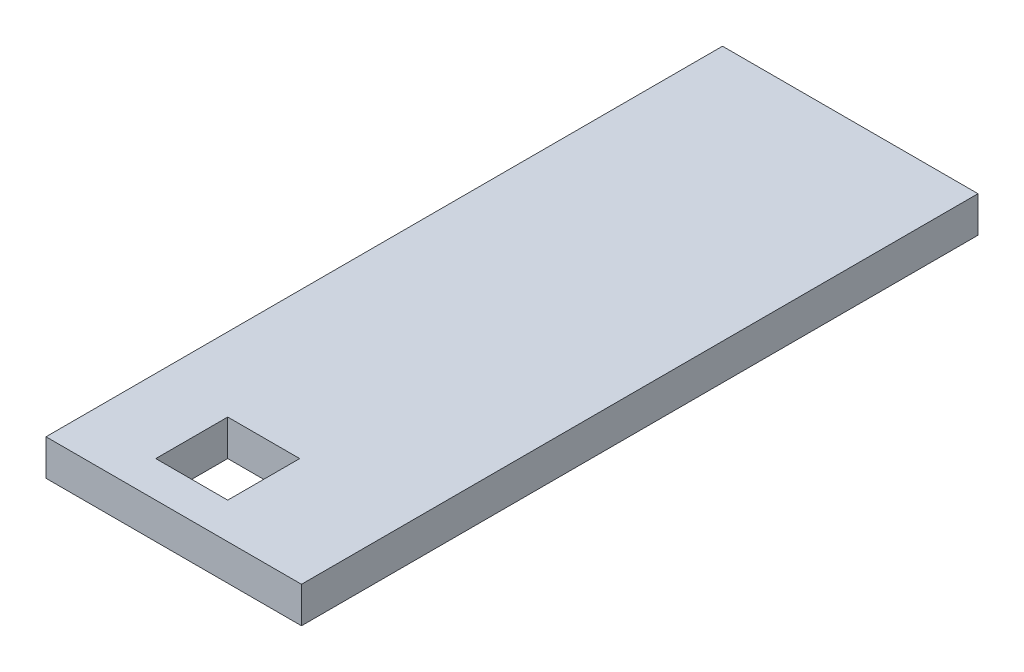
ISO-10303-21;
HEADER;
FILE_DESCRIPTION(('STEP AP214'),'2;1');
FILE_NAME('part.step','',(''),(''),'','','');
FILE_SCHEMA(('AUTOMOTIVE_DESIGN { 1 0 10303 214 1 1 1 1 }'));
ENDSEC;
DATA;
#1=APPLICATION_CONTEXT('core data for automotive mechanical design processes');
#2=APPLICATION_PROTOCOL_DEFINITION('international standard','automotive_design',2000,#1);
#3=PRODUCT_CONTEXT('',#1,'mechanical');
#4=PRODUCT('Part','Part','',(#3));
#5=PRODUCT_RELATED_PRODUCT_CATEGORY('part','',(#4));
#6=PRODUCT_DEFINITION_FORMATION('','',#4);
#7=PRODUCT_DEFINITION_CONTEXT('part definition',#1,'design');
#8=PRODUCT_DEFINITION('design','',#6,#7);
#9=PRODUCT_DEFINITION_SHAPE('','',#8);
#10=(LENGTH_UNIT() NAMED_UNIT(*) SI_UNIT(.MILLI.,.METRE.));
#11=(NAMED_UNIT(*) PLANE_ANGLE_UNIT() SI_UNIT($,.RADIAN.));
#12=(NAMED_UNIT(*) SI_UNIT($,.STERADIAN.) SOLID_ANGLE_UNIT());
#13=UNCERTAINTY_MEASURE_WITH_UNIT(LENGTH_MEASURE(1.E-05),#10,'distance_accuracy_value','');
#14=(GEOMETRIC_REPRESENTATION_CONTEXT(3) GLOBAL_UNCERTAINTY_ASSIGNED_CONTEXT((#13)) GLOBAL_UNIT_ASSIGNED_CONTEXT((#10,
#11,#12)) REPRESENTATION_CONTEXT('',''));
#15=CARTESIAN_POINT('',(0.,0.,0.));
#16=DIRECTION('',(0.,0.,1.));
#17=DIRECTION('',(1.,0.,0.));
#18=AXIS2_PLACEMENT_3D('',#15,#16,#17);
#19=CARTESIAN_POINT('',(0.,0.,940.));
#20=DIRECTION('',(1.,0.,0.));
#21=DIRECTION('',(0.,0.,-1.));
#22=AXIS2_PLACEMENT_3D('',#19,#20,#21);
#23=PLANE('',#22);
#24=DIRECTION('',(0.,-1.,0.));
#25=VECTOR('',#24,1.);
#26=CARTESIAN_POINT('',(0.,0.,0.));
#27=LINE('',#26,#25);
#28=CARTESIAN_POINT('',(0.,50.,0.));
#29=VERTEX_POINT('',#28);
#30=CARTESIAN_POINT('',(0.,0.,0.));
#31=VERTEX_POINT('',#30);
#32=EDGE_CURVE('E130',#29,#31,#27,.T.);
#33=ORIENTED_EDGE('',*,*,#32,.T.);
#34=DIRECTION('',(0.,0.,-1.));
#35=VECTOR('',#34,1.);
#36=CARTESIAN_POINT('',(0.,0.,940.));
#37=LINE('',#36,#35);
#38=CARTESIAN_POINT('',(0.,0.,940.));
#39=VERTEX_POINT('',#38);
#40=EDGE_CURVE('E11',#39,#31,#37,.T.);
#41=ORIENTED_EDGE('',*,*,#40,.F.);
#42=DIRECTION('',(0.,-1.,0.));
#43=VECTOR('',#42,1.);
#44=CARTESIAN_POINT('',(0.,0.,940.));
#45=LINE('',#44,#43);
#46=CARTESIAN_POINT('',(0.,50.,940.));
#47=VERTEX_POINT('',#46);
#48=EDGE_CURVE('E134',#47,#39,#45,.T.);
#49=ORIENTED_EDGE('',*,*,#48,.F.);
#50=DIRECTION('',(0.,0.,-1.));
#51=VECTOR('',#50,1.);
#52=CARTESIAN_POINT('',(0.,50.,940.));
#53=LINE('',#52,#51);
#54=EDGE_CURVE('E144',#47,#29,#53,.T.);
#55=ORIENTED_EDGE('',*,*,#54,.T.);
#56=EDGE_LOOP('',(#33,#41,#49,#55));
#57=FACE_BOUND('',#56,.T.);
#58=ADVANCED_FACE('F33',(#57),#23,.F.);
#59=CARTESIAN_POINT('',(0.,0.,940.));
#60=DIRECTION('',(0.,1.,0.));
#61=DIRECTION('',(0.,0.,1.));
#62=AXIS2_PLACEMENT_3D('',#59,#60,#61);
#63=PLANE('',#62);
#64=DIRECTION('',(1.,0.,0.));
#65=VECTOR('',#64,1.);
#66=CARTESIAN_POINT('',(202.5,0.,890.));
#67=LINE('',#66,#65);
#68=CARTESIAN_POINT('',(102.5,0.,890.));
#69=VERTEX_POINT('',#68);
#70=CARTESIAN_POINT('',(202.5,0.,890.));
#71=VERTEX_POINT('',#70);
#72=EDGE_CURVE('E105',#69,#71,#67,.T.);
#73=ORIENTED_EDGE('',*,*,#72,.T.);
#74=DIRECTION('',(0.,0.,-1.));
#75=VECTOR('',#74,1.);
#76=CARTESIAN_POINT('',(202.5,0.,890.));
#77=LINE('',#76,#75);
#78=CARTESIAN_POINT('',(202.5,0.,790.));
#79=VERTEX_POINT('',#78);
#80=EDGE_CURVE('E99',#71,#79,#77,.T.);
#81=ORIENTED_EDGE('',*,*,#80,.T.);
#82=DIRECTION('',(-1.,0.,0.));
#83=VECTOR('',#82,1.);
#84=CARTESIAN_POINT('',(202.5,0.,790.));
#85=LINE('',#84,#83);
#86=CARTESIAN_POINT('',(102.5,0.,790.));
#87=VERTEX_POINT('',#86);
#88=EDGE_CURVE('E108',#79,#87,#85,.T.);
#89=ORIENTED_EDGE('',*,*,#88,.T.);
#90=DIRECTION('',(0.,0.,1.));
#91=VECTOR('',#90,1.);
#92=CARTESIAN_POINT('',(102.5,0.,890.));
#93=LINE('',#92,#91);
#94=EDGE_CURVE('E47',#87,#69,#93,.T.);
#95=ORIENTED_EDGE('',*,*,#94,.T.);
#96=EDGE_LOOP('',(#73,#81,#89,#95));
#97=FACE_BOUND('',#96,.T.);
#98=DIRECTION('',(1.,0.,0.));
#99=VECTOR('',#98,1.);
#100=CARTESIAN_POINT('',(0.,0.,0.));
#101=LINE('',#100,#99);
#102=CARTESIAN_POINT('',(355.,0.,0.));
#103=VERTEX_POINT('',#102);
#104=EDGE_CURVE('E147',#31,#103,#101,.T.);
#105=ORIENTED_EDGE('',*,*,#104,.T.);
#106=DIRECTION('',(0.,0.,-1.));
#107=VECTOR('',#106,1.);
#108=CARTESIAN_POINT('',(355.,0.,940.));
#109=LINE('',#108,#107);
#110=CARTESIAN_POINT('',(355.,0.,940.));
#111=VERTEX_POINT('',#110);
#112=EDGE_CURVE('E40',#111,#103,#109,.T.);
#113=ORIENTED_EDGE('',*,*,#112,.F.);
#114=DIRECTION('',(1.,0.,0.));
#115=VECTOR('',#114,1.);
#116=CARTESIAN_POINT('',(0.,0.,940.));
#117=LINE('',#116,#115);
#118=EDGE_CURVE('E137',#39,#111,#117,.T.);
#119=ORIENTED_EDGE('',*,*,#118,.F.);
#120=ORIENTED_EDGE('',*,*,#40,.T.);
#121=EDGE_LOOP('',(#105,#113,#119,#120));
#122=FACE_BOUND('',#121,.T.);
#123=ADVANCED_FACE('F112',(#97,#122),#63,.F.);
#124=CARTESIAN_POINT('',(355.,0.,940.));
#125=DIRECTION('',(-1.,0.,0.));
#126=DIRECTION('',(0.,0.,1.));
#127=AXIS2_PLACEMENT_3D('',#124,#125,#126);
#128=PLANE('',#127);
#129=DIRECTION('',(0.,1.,0.));
#130=VECTOR('',#129,1.);
#131=CARTESIAN_POINT('',(355.,0.,0.));
#132=LINE('',#131,#130);
#133=CARTESIAN_POINT('',(355.,50.,0.));
#134=VERTEX_POINT('',#133);
#135=EDGE_CURVE('E149',#103,#134,#132,.T.);
#136=ORIENTED_EDGE('',*,*,#135,.T.);
#137=DIRECTION('',(0.,0.,-1.));
#138=VECTOR('',#137,1.);
#139=CARTESIAN_POINT('',(355.,50.,940.));
#140=LINE('',#139,#138);
#141=CARTESIAN_POINT('',(355.,50.,940.));
#142=VERTEX_POINT('',#141);
#143=EDGE_CURVE('E154',#142,#134,#140,.T.);
#144=ORIENTED_EDGE('',*,*,#143,.F.);
#145=DIRECTION('',(0.,1.,0.));
#146=VECTOR('',#145,1.);
#147=CARTESIAN_POINT('',(355.,0.,940.));
#148=LINE('',#147,#146);
#149=EDGE_CURVE('E140',#111,#142,#148,.T.);
#150=ORIENTED_EDGE('',*,*,#149,.F.);
#151=ORIENTED_EDGE('',*,*,#112,.T.);
#152=EDGE_LOOP('',(#136,#144,#150,#151));
#153=FACE_BOUND('',#152,.T.);
#154=ADVANCED_FACE('F161',(#153),#128,.F.);
#155=CARTESIAN_POINT('',(0.,50.,940.));
#156=DIRECTION('',(0.,-1.,0.));
#157=DIRECTION('',(0.,0.,-1.));
#158=AXIS2_PLACEMENT_3D('',#155,#156,#157);
#159=PLANE('',#158);
#160=DIRECTION('',(-1.,0.,0.));
#161=VECTOR('',#160,1.);
#162=CARTESIAN_POINT('',(202.5,50.,790.));
#163=LINE('',#162,#161);
#164=CARTESIAN_POINT('',(202.5,50.,790.));
#165=VERTEX_POINT('',#164);
#166=CARTESIAN_POINT('',(102.5,50.,790.));
#167=VERTEX_POINT('',#166);
#168=EDGE_CURVE('E124',#165,#167,#163,.T.);
#169=ORIENTED_EDGE('',*,*,#168,.F.);
#170=DIRECTION('',(0.,0.,-1.));
#171=VECTOR('',#170,1.);
#172=CARTESIAN_POINT('',(202.5,50.,890.));
#173=LINE('',#172,#171);
#174=CARTESIAN_POINT('',(202.5,50.,890.));
#175=VERTEX_POINT('',#174);
#176=EDGE_CURVE('E55',#175,#165,#173,.T.);
#177=ORIENTED_EDGE('',*,*,#176,.F.);
#178=DIRECTION('',(1.,0.,0.));
#179=VECTOR('',#178,1.);
#180=CARTESIAN_POINT('',(202.5,50.,890.));
#181=LINE('',#180,#179);
#182=CARTESIAN_POINT('',(102.5,50.,890.));
#183=VERTEX_POINT('',#182);
#184=EDGE_CURVE('E115',#183,#175,#181,.T.);
#185=ORIENTED_EDGE('',*,*,#184,.F.);
#186=DIRECTION('',(0.,0.,1.));
#187=VECTOR('',#186,1.);
#188=CARTESIAN_POINT('',(102.5,50.,890.));
#189=LINE('',#188,#187);
#190=EDGE_CURVE('E118',#167,#183,#189,.T.);
#191=ORIENTED_EDGE('',*,*,#190,.F.);
#192=EDGE_LOOP('',(#169,#177,#185,#191));
#193=FACE_BOUND('',#192,.T.);
#194=DIRECTION('',(-1.,0.,0.));
#195=VECTOR('',#194,1.);
#196=CARTESIAN_POINT('',(0.,50.,0.));
#197=LINE('',#196,#195);
#198=EDGE_CURVE('E138',#134,#29,#197,.T.);
#199=ORIENTED_EDGE('',*,*,#198,.T.);
#200=ORIENTED_EDGE('',*,*,#54,.F.);
#201=DIRECTION('',(-1.,0.,0.));
#202=VECTOR('',#201,1.);
#203=CARTESIAN_POINT('',(0.,50.,940.));
#204=LINE('',#203,#202);
#205=EDGE_CURVE('E142',#142,#47,#204,.T.);
#206=ORIENTED_EDGE('',*,*,#205,.F.);
#207=ORIENTED_EDGE('',*,*,#143,.T.);
#208=EDGE_LOOP('',(#199,#200,#206,#207));
#209=FACE_BOUND('',#208,.T.);
#210=ADVANCED_FACE('F169',(#193,#209),#159,.F.);
#211=CARTESIAN_POINT('',(0.,0.,940.));
#212=DIRECTION('',(0.,0.,-1.));
#213=DIRECTION('',(-1.,0.,0.));
#214=AXIS2_PLACEMENT_3D('',#211,#212,#213);
#215=PLANE('',#214);
#216=ORIENTED_EDGE('',*,*,#48,.T.);
#217=ORIENTED_EDGE('',*,*,#118,.T.);
#218=ORIENTED_EDGE('',*,*,#149,.T.);
#219=ORIENTED_EDGE('',*,*,#205,.T.);
#220=EDGE_LOOP('',(#216,#217,#218,#219));
#221=FACE_BOUND('',#220,.T.);
#222=ADVANCED_FACE('F175',(#221),#215,.F.);
#223=CARTESIAN_POINT('',(0.,0.,0.));
#224=DIRECTION('',(0.,0.,-1.));
#225=DIRECTION('',(-1.,0.,0.));
#226=AXIS2_PLACEMENT_3D('',#223,#224,#225);
#227=PLANE('',#226);
#228=ORIENTED_EDGE('',*,*,#32,.F.);
#229=ORIENTED_EDGE('',*,*,#198,.F.);
#230=ORIENTED_EDGE('',*,*,#135,.F.);
#231=ORIENTED_EDGE('',*,*,#104,.F.);
#232=EDGE_LOOP('',(#228,#229,#230,#231));
#233=FACE_BOUND('',#232,.T.);
#234=ADVANCED_FACE('F166',(#233),#227,.T.);
#235=CARTESIAN_POINT('',(202.5,0.,890.));
#236=DIRECTION('',(1.,0.,0.));
#237=DIRECTION('',(0.,0.,-1.));
#238=AXIS2_PLACEMENT_3D('',#235,#236,#237);
#239=PLANE('',#238);
#240=ORIENTED_EDGE('',*,*,#176,.T.);
#241=DIRECTION('',(0.,1.,0.));
#242=VECTOR('',#241,1.);
#243=CARTESIAN_POINT('',(202.5,0.,790.));
#244=LINE('',#243,#242);
#245=EDGE_CURVE('E95',#79,#165,#244,.T.);
#246=ORIENTED_EDGE('',*,*,#245,.F.);
#247=ORIENTED_EDGE('',*,*,#80,.F.);
#248=DIRECTION('',(0.,1.,0.));
#249=VECTOR('',#248,1.);
#250=CARTESIAN_POINT('',(202.5,0.,890.));
#251=LINE('',#250,#249);
#252=EDGE_CURVE('E128',#71,#175,#251,.T.);
#253=ORIENTED_EDGE('',*,*,#252,.T.);
#254=EDGE_LOOP('',(#240,#246,#247,#253));
#255=FACE_BOUND('',#254,.T.);
#256=ADVANCED_FACE('F97',(#255),#239,.F.);
#257=CARTESIAN_POINT('',(202.5,0.,890.));
#258=DIRECTION('',(0.,0.,1.));
#259=DIRECTION('',(1.,0.,0.));
#260=AXIS2_PLACEMENT_3D('',#257,#258,#259);
#261=PLANE('',#260);
#262=ORIENTED_EDGE('',*,*,#184,.T.);
#263=ORIENTED_EDGE('',*,*,#252,.F.);
#264=ORIENTED_EDGE('',*,*,#72,.F.);
#265=DIRECTION('',(0.,1.,0.));
#266=VECTOR('',#265,1.);
#267=CARTESIAN_POINT('',(102.5,0.,890.));
#268=LINE('',#267,#266);
#269=EDGE_CURVE('E131',#69,#183,#268,.T.);
#270=ORIENTED_EDGE('',*,*,#269,.T.);
#271=EDGE_LOOP('',(#262,#263,#264,#270));
#272=FACE_BOUND('',#271,.T.);
#273=ADVANCED_FACE('F193',(#272),#261,.F.);
#274=CARTESIAN_POINT('',(102.5,0.,890.));
#275=DIRECTION('',(-1.,0.,0.));
#276=DIRECTION('',(0.,0.,1.));
#277=AXIS2_PLACEMENT_3D('',#274,#275,#276);
#278=PLANE('',#277);
#279=ORIENTED_EDGE('',*,*,#190,.T.);
#280=ORIENTED_EDGE('',*,*,#269,.F.);
#281=ORIENTED_EDGE('',*,*,#94,.F.);
#282=DIRECTION('',(0.,1.,0.));
#283=VECTOR('',#282,1.);
#284=CARTESIAN_POINT('',(102.5,0.,790.));
#285=LINE('',#284,#283);
#286=EDGE_CURVE('E104',#87,#167,#285,.T.);
#287=ORIENTED_EDGE('',*,*,#286,.T.);
#288=EDGE_LOOP('',(#279,#280,#281,#287));
#289=FACE_BOUND('',#288,.T.);
#290=ADVANCED_FACE('F196',(#289),#278,.F.);
#291=CARTESIAN_POINT('',(202.5,0.,790.));
#292=DIRECTION('',(0.,0.,-1.));
#293=DIRECTION('',(-1.,0.,0.));
#294=AXIS2_PLACEMENT_3D('',#291,#292,#293);
#295=PLANE('',#294);
#296=ORIENTED_EDGE('',*,*,#168,.T.);
#297=ORIENTED_EDGE('',*,*,#286,.F.);
#298=ORIENTED_EDGE('',*,*,#88,.F.);
#299=ORIENTED_EDGE('',*,*,#245,.T.);
#300=EDGE_LOOP('',(#296,#297,#298,#299));
#301=FACE_BOUND('',#300,.T.);
#302=ADVANCED_FACE('F109',(#301),#295,.F.);
#303=CLOSED_SHELL('',(#58,#123,#154,#210,#222,#234,#256,#273,#290,#302));
#304=MANIFOLD_SOLID_BREP('B2',#303);
#305=ADVANCED_BREP_SHAPE_REPRESENTATION('',(#18,#304),#14);
#306=SHAPE_DEFINITION_REPRESENTATION(#9,#305);
ENDSEC;
END-ISO-10303-21;
